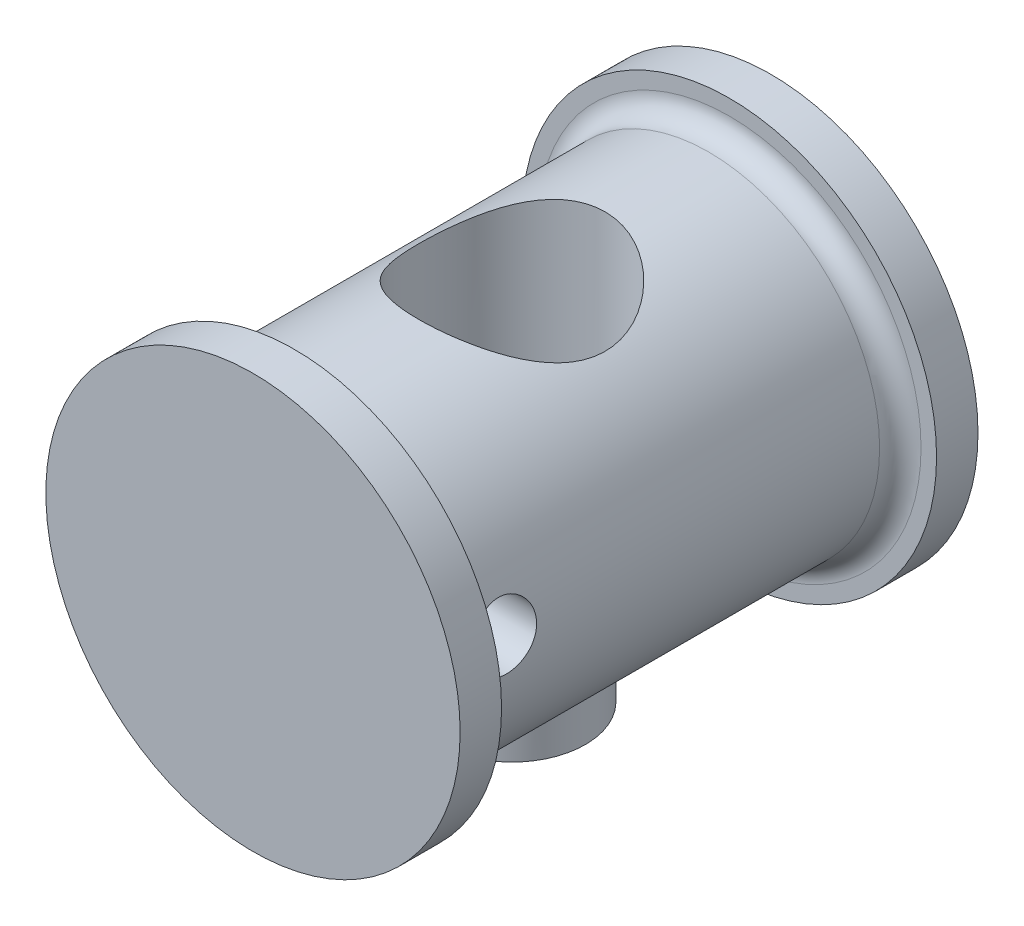
ISO-10303-21;
HEADER;
FILE_DESCRIPTION(('STEP AP214'),'2;1');
FILE_NAME('part.step','',(''),(''),'','','');
FILE_SCHEMA(('AUTOMOTIVE_DESIGN { 1 0 10303 214 1 1 1 1 }'));
ENDSEC;
DATA;
#1=APPLICATION_CONTEXT('core data for automotive mechanical design processes');
#2=APPLICATION_PROTOCOL_DEFINITION('international standard','automotive_design',2000,#1);
#3=PRODUCT_CONTEXT('',#1,'mechanical');
#4=PRODUCT('Part','Part','',(#3));
#5=PRODUCT_RELATED_PRODUCT_CATEGORY('part','',(#4));
#6=PRODUCT_DEFINITION_FORMATION('','',#4);
#7=PRODUCT_DEFINITION_CONTEXT('part definition',#1,'design');
#8=PRODUCT_DEFINITION('design','',#6,#7);
#9=PRODUCT_DEFINITION_SHAPE('','',#8);
#10=(LENGTH_UNIT() NAMED_UNIT(*) SI_UNIT(.MILLI.,.METRE.));
#11=(NAMED_UNIT(*) PLANE_ANGLE_UNIT() SI_UNIT($,.RADIAN.));
#12=(NAMED_UNIT(*) SI_UNIT($,.STERADIAN.) SOLID_ANGLE_UNIT());
#13=UNCERTAINTY_MEASURE_WITH_UNIT(LENGTH_MEASURE(1.E-05),#10,'distance_accuracy_value','');
#14=(GEOMETRIC_REPRESENTATION_CONTEXT(3) GLOBAL_UNCERTAINTY_ASSIGNED_CONTEXT((#13)) GLOBAL_UNIT_ASSIGNED_CONTEXT((#10,
#11,#12)) REPRESENTATION_CONTEXT('',''));
#15=CARTESIAN_POINT('',(0.,0.,0.));
#16=DIRECTION('',(0.,0.,1.));
#17=DIRECTION('',(1.,0.,0.));
#18=AXIS2_PLACEMENT_3D('',#15,#16,#17);
#19=CARTESIAN_POINT('',(0.,0.,23.));
#20=DIRECTION('',(0.,0.,-1.));
#21=DIRECTION('',(-1.,0.,0.));
#22=AXIS2_PLACEMENT_3D('',#19,#20,#21);
#23=CYLINDRICAL_SURFACE('',#22,8.25);
#24=CARTESIAN_POINT('',(0.,-8.25,16.05));
#25=CARTESIAN_POINT('',(0.0948469331028843,-8.24999941654784,16.0499992762641));
#26=CARTESIAN_POINT('',(0.189722373322269,-8.24835985622079,16.0461936116757));
#27=CARTESIAN_POINT('',(0.37879270250265,-8.24184301155923,16.0310085627969));
#28=CARTESIAN_POINT('',(0.47298714639651,-8.23696377467082,16.01962461106));
#29=CARTESIAN_POINT('',(0.66014822212969,-8.22408127904581,15.9893699138893));
#30=CARTESIAN_POINT('',(0.753112067923616,-8.2160718816281,15.9704844557567));
#31=CARTESIAN_POINT('',(0.936966881314438,-8.19714331725011,15.9254297808454));
#32=CARTESIAN_POINT('',(1.0278569851592,-8.18622296100178,15.8992575868364));
#33=CARTESIAN_POINT('',(1.29577426160629,-8.14958558054659,15.8103931914332));
#34=CARTESIAN_POINT('',(1.46891455704396,-8.11992880547429,15.7372107980347));
#35=CARTESIAN_POINT('',(1.80019289226469,-8.05297867683058,15.5654026633834));
#36=CARTESIAN_POINT('',(1.95833491101552,-8.01568735700486,15.4667836962963));
#37=CARTESIAN_POINT('',(2.26386131686089,-7.93495880202975,15.2413803695284));
#38=CARTESIAN_POINT('',(2.41035745076404,-7.8913117419413,15.1134658807328));
#39=CARTESIAN_POINT('',(2.68058545097449,-7.80366517504599,14.8355037504318));
#40=CARTESIAN_POINT('',(2.80430458040487,-7.75966548531235,14.6854438091956));
#41=CARTESIAN_POINT('',(3.03200593646147,-7.6736595473822,14.3577707863266));
#42=CARTESIAN_POINT('',(3.13458534663323,-7.6318844194267,14.1791156483166));
#43=CARTESIAN_POINT('',(3.30783957663943,-7.55841383436547,13.8050360181697));
#44=CARTESIAN_POINT('',(3.37853190288042,-7.52671284926156,13.6096207978374));
#45=CARTESIAN_POINT('',(3.4822714021748,-7.47926538347933,13.2178061689824));
#46=CARTESIAN_POINT('',(3.5170362384057,-7.4627953559361,13.021952693413));
#47=CARTESIAN_POINT('',(3.55328482170222,-7.44561032856402,12.6265534138518));
#48=CARTESIAN_POINT('',(3.55478872861949,-7.44488578521134,12.4270099198413));
#49=CARTESIAN_POINT('',(3.52576025142631,-7.45866543768918,12.0475497444452));
#50=CARTESIAN_POINT('',(3.49786995607576,-7.4719137589883,11.8673759144689));
#51=CARTESIAN_POINT('',(3.41529880544016,-7.51001194051937,11.5145704153489));
#52=CARTESIAN_POINT('',(3.36061240543848,-7.53486420181731,11.3419403152282));
#53=CARTESIAN_POINT('',(3.22492265821118,-7.59394040667487,11.0046196013975));
#54=CARTESIAN_POINT('',(3.14336915967483,-7.62835768394853,10.8401856823871));
#55=CARTESIAN_POINT('',(2.95665212220401,-7.70264816520028,10.5266696213183));
#56=CARTESIAN_POINT('',(2.85147894400911,-7.74252359406422,10.3775937832729));
#57=CARTESIAN_POINT('',(2.60932049805252,-7.82763336933429,10.0847923909421));
#58=CARTESIAN_POINT('',(2.47031502340579,-7.87302572643232,9.94277862191908));
#59=CARTESIAN_POINT('',(2.17004301174153,-7.96102231256706,9.68348177614448));
#60=CARTESIAN_POINT('',(2.00877056944055,-8.00362579755147,9.56620528073527));
#61=CARTESIAN_POINT('',(1.66304501378815,-8.08263506996168,9.35697022865307));
#62=CARTESIAN_POINT('',(1.47809671438876,-8.11885005791334,9.26575242598592));
#63=CARTESIAN_POINT('',(1.09352204674423,-8.17951725515854,9.11633423068023));
#64=CARTESIAN_POINT('',(0.893904422687285,-8.20397640742124,9.05811434589724));
#65=CARTESIAN_POINT('',(0.499924175597833,-8.2370522777234,8.98003019522668));
#66=CARTESIAN_POINT('',(0.306095766234473,-8.24661489219512,8.95787143282697));
#67=CARTESIAN_POINT('',(-0.0827321205770949,-8.25187318121418,8.94564290875392));
#68=CARTESIAN_POINT('',(-0.277731213842414,-8.24757318068952,8.95556313891885));
#69=CARTESIAN_POINT('',(-0.65232508916051,-8.22619674103216,9.00560882799403));
#70=CARTESIAN_POINT('',(-0.832184849764946,-8.20981859569963,9.04408413362153));
#71=CARTESIAN_POINT('',(-1.18267511571,-8.16669932868962,9.14780751506341));
#72=CARTESIAN_POINT('',(-1.35330447239368,-8.13995692061989,9.21305891433391));
#73=CARTESIAN_POINT('',(-1.68652419849457,-8.07760979610183,9.37059675749733));
#74=CARTESIAN_POINT('',(-1.84869694075649,-8.04175433329538,9.46366405264152));
#75=CARTESIAN_POINT('',(-2.15570820818722,-7.96495486748056,9.67333846910314));
#76=CARTESIAN_POINT('',(-2.30053927125945,-7.92400868928249,9.78995566633415));
#77=CARTESIAN_POINT('',(-2.58033519598601,-7.83756420069752,10.0537606637086));
#78=CARTESIAN_POINT('',(-2.71371529758467,-7.79195634876633,10.2025975974126));
#79=CARTESIAN_POINT('',(-2.95409184521255,-7.70404191670882,10.5211935446004));
#80=CARTESIAN_POINT('',(-3.06108074727041,-7.66173628288428,10.690958519652));
#81=CARTESIAN_POINT('',(-3.24724631413392,-7.58473920147911,11.0509711298865));
#82=CARTESIAN_POINT('',(-3.32587129526257,-7.55020325156891,11.241539833683));
#83=CARTESIAN_POINT('',(-3.44920536829271,-7.49467415061237,11.6351758349875));
#84=CARTESIAN_POINT('',(-3.49394494958785,-7.47366882753414,11.8382317184579));
#85=CARTESIAN_POINT('',(-3.54511560261101,-7.44952230206882,12.2333795118794));
#86=CARTESIAN_POINT('',(-3.5543533697529,-7.44507320565556,12.4250291991556));
#87=CARTESIAN_POINT('',(-3.54185229338584,-7.4510291431009,12.8070595627466));
#88=CARTESIAN_POINT('',(-3.52011902597578,-7.46143150306852,12.9974404612974));
#89=CARTESIAN_POINT('',(-3.44870101169222,-7.49468959537969,13.3611043443057));
#90=CARTESIAN_POINT('',(-3.40055637869725,-7.51685713763611,13.5347589778937));
#91=CARTESIAN_POINT('',(-3.2792442769436,-7.57056355625933,13.8715375982604));
#92=CARTESIAN_POINT('',(-3.20606968134227,-7.6021051013731,14.0346585700206));
#93=CARTESIAN_POINT('',(-3.03155003601852,-7.67343512816292,14.3568342582736));
#94=CARTESIAN_POINT('',(-2.92873555963809,-7.71361461383294,14.5150045492172));
#95=CARTESIAN_POINT('',(-2.69983031900395,-7.79668022972563,14.8127253594895));
#96=CARTESIAN_POINT('',(-2.57373065064436,-7.83956739120328,14.9522687207138));
#97=CARTESIAN_POINT('',(-2.28994484021477,-7.92732162881532,15.2202438533367));
#98=CARTESIAN_POINT('',(-2.13054091303928,-7.97207351335353,15.3468997420883));
#99=CARTESIAN_POINT('',(-1.79100725750145,-8.05513647020764,15.571838288264));
#100=CARTESIAN_POINT('',(-1.610868183702,-8.09344461900267,15.6701080813503));
#101=CARTESIAN_POINT('',(-1.33026352287112,-8.14259353909228,15.7928985739159));
#102=CARTESIAN_POINT('',(-1.23565746811196,-8.1575187824491,15.8295626171587));
#103=CARTESIAN_POINT('',(-1.04328148603078,-8.18434271709117,15.8947542449475));
#104=CARTESIAN_POINT('',(-0.9455130956649,-8.19624285444334,15.9232857178343));
#105=CARTESIAN_POINT('',(-0.747802355913359,-8.21663875919326,15.9718344998425));
#106=CARTESIAN_POINT('',(-0.647865925522157,-8.22514280335794,15.9918725161535));
#107=CARTESIAN_POINT('',(-0.446449899101305,-8.2385285033673,16.0232877024214));
#108=CARTESIAN_POINT('',(-0.344971459352585,-8.2434127487849,16.0346710639951));
#109=CARTESIAN_POINT('',(-0.2027157238319,-8.24760872449806,16.0444398160064));
#110=CARTESIAN_POINT('',(-0.162207843747729,-8.24850486040589,16.0465241995115));
#111=CARTESIAN_POINT('',(-0.0811350479585505,-8.24970062495101,16.0493044509743));
#112=CARTESIAN_POINT('',(-0.0405701318709548,-8.2500002495677,16.0500003095731));
#113=CARTESIAN_POINT('',(0.,-8.25,16.05));
#114=B_SPLINE_CURVE_WITH_KNOTS('',3,(#24,#25,#26,#27,#28,#29,#30,#31,#32,#33,#34,#35,#36,#37,
#38,#39,#40,#41,#42,#43,#44,#45,#46,#47,#48,#49,#50,#51,#52,#53,#54,#55,#56,#57,#58,#59,#60,#61,
#62,#63,#64,#65,#66,#67,#68,#69,#70,#71,#72,#73,#74,#75,#76,#77,#78,#79,#80,#81,#82,#83,#84,#85,
#86,#87,#88,#89,#90,#91,#92,#93,#94,#95,#96,#97,#98,#99,#100,#101,#102,#103,#104,#105,#106,#107,
#108,#109,#110,#111,#112,#113),.UNSPECIFIED.,.T.,.F.,(4,2,2,2,2,2,2,2,2,2,2,2,2,2,2,2,2,2,2,2,2,
2,2,2,2,2,2,2,2,2,2,2,2,2,2,2,2,2,2,2,2,2,2,2,4),(0.,0.284499582123413,0.569170788053065,
0.854403098267682,1.13975212077609,1.70784337353672,2.27578349045981,2.87114926051802,
3.46684695389576,4.09428388279809,4.72137592048183,5.31686421920878,5.91199157537535,
6.45784623558598,7.00381389312939,7.5617391167497,8.11989244638598,8.72867275791427,
9.33761483149395,9.96245156924814,10.5869188250354,11.1698322680953,11.7525638685031,
12.3040116219281,12.8555278419134,13.4242724136882,13.9932608424886,14.605463553054,
15.2178410605852,15.8415579662998,16.4647129953207,17.037447781605,17.6100794643797,
18.1524063996287,18.6948878816733,19.2711209650207,19.8475748541756,20.4700394343669,
21.0927856692264,21.4001056661737,21.7072784800085,22.013698032749,22.3198981634097,
22.4415901084303,22.5632828736719),.UNSPECIFIED.);
#115=CARTESIAN_POINT('',(0.,-8.25,16.05));
#116=VERTEX_POINT('',#115);
#117=EDGE_CURVE('E144',#116,#116,#114,.T.);
#118=ORIENTED_EDGE('',*,*,#117,.T.);
#119=EDGE_LOOP('',(#118));
#120=FACE_BOUND('',#119,.T.);
#121=CARTESIAN_POINT('',(0.,8.25,17.));
#122=CARTESIAN_POINT('',(-0.117007792381533,8.25000089369985,17.0000010184365));
#123=CARTESIAN_POINT('',(-0.234003420881799,8.24750583855399,16.9954320889132));
#124=CARTESIAN_POINT('',(-0.467116010873188,8.23759141748326,16.9772169926997));
#125=CARTESIAN_POINT('',(-0.583232690180944,8.23017053275026,16.9635680263089));
#126=CARTESIAN_POINT('',(-0.813773759209355,8.21058288767439,16.9273471687061));
#127=CARTESIAN_POINT('',(-0.928196339379707,8.19841138606453,16.9047663629303));
#128=CARTESIAN_POINT('',(-1.15445890990384,8.16962292222351,16.8509487487343));
#129=CARTESIAN_POINT('',(-1.26629782511657,8.15300414429728,16.8197084046865));
#130=CARTESIAN_POINT('',(-1.48611767232912,8.1158067902385,16.7490843476864));
#131=CARTESIAN_POINT('',(-1.59411388426755,8.09524663528627,16.7097384569149));
#132=CARTESIAN_POINT('',(-1.80617898604951,8.05058900158713,16.6232087052642));
#133=CARTESIAN_POINT('',(-1.91024638018985,8.02649019240801,16.5760218955428));
#134=CARTESIAN_POINT('',(-2.21563066426775,7.94968018368127,16.4233532711087));
#135=CARTESIAN_POINT('',(-2.41034577816859,7.89241725192212,16.3066929924822));
#136=CARTESIAN_POINT('',(-2.79102264454454,7.76631680324919,16.0381018671834));
#137=CARTESIAN_POINT('',(-2.97548660882861,7.69695676253121,15.8843108499678));
#138=CARTESIAN_POINT('',(-3.31742706348696,7.55588682742557,15.5499130861412));
#139=CARTESIAN_POINT('',(-3.47487876280306,7.4841748456225,15.3692819871682));
#140=CARTESIAN_POINT('',(-3.77370766706972,7.33838324825958,14.9653693760866));
#141=CARTESIAN_POINT('',(-3.91206770934792,7.26474289282666,14.7396542239182));
#142=CARTESIAN_POINT('',(-4.08918174832862,7.16559101578268,14.3831494708436));
#143=CARTESIAN_POINT('',(-4.14316145664846,7.13441680430406,14.2612829975954));
#144=CARTESIAN_POINT('',(-4.24039560985482,7.07705641005852,14.0122427700648));
#145=CARTESIAN_POINT('',(-4.28365694104436,7.05086702717761,13.8850724850448));
#146=CARTESIAN_POINT('',(-4.35649685900765,7.00607962860003,13.6344140144808));
#147=CARTESIAN_POINT('',(-4.38676086645427,6.98710985197453,13.5111913345982));
#148=CARTESIAN_POINT('',(-4.43684997851687,6.95541114205248,13.2619109383586));
#149=CARTESIAN_POINT('',(-4.45668117946307,6.94267856439683,13.1358549226475));
#150=CARTESIAN_POINT('',(-4.4855622164643,6.92405439774008,12.8821249703092));
#151=CARTESIAN_POINT('',(-4.49462196143917,6.91815652146044,12.7544526300424));
#152=CARTESIAN_POINT('',(-4.50181757609972,6.91347663111143,12.4986790518571));
#153=CARTESIAN_POINT('',(-4.49995489136689,6.91469367538362,12.3705778729381));
#154=CARTESIAN_POINT('',(-4.48643899826711,6.92346836270181,12.1343575226411));
#155=CARTESIAN_POINT('',(-4.47629021539421,6.93005146116994,12.0261125609943));
#156=CARTESIAN_POINT('',(-4.44826868009311,6.94806975608009,11.8110252239356));
#157=CARTESIAN_POINT('',(-4.43039357007402,6.95950643351092,11.7041832869004));
#158=CARTESIAN_POINT('',(-4.36548093483983,7.00055530889966,11.3868537695812));
#159=CARTESIAN_POINT('',(-4.30714809809194,7.03691206132032,11.1794284652603));
#160=CARTESIAN_POINT('',(-4.16127143810793,7.12415675670677,10.7732944527693));
#161=CARTESIAN_POINT('',(-4.07311742117085,7.17534474334264,10.5748750870656));
#162=CARTESIAN_POINT('',(-3.87059595680085,7.28658520272543,10.1945909307381));
#163=CARTESIAN_POINT('',(-3.75621709609637,7.34664153098619,10.0127333962509));
#164=CARTESIAN_POINT('',(-3.48397421759499,7.48002699593312,9.64117127017421));
#165=CARTESIAN_POINT('',(-3.32211977995778,7.55397177425163,9.45460851015597));
#166=CARTESIAN_POINT('',(-2.96934435934312,7.69946976800308,9.10975019326253));
#167=CARTESIAN_POINT('',(-2.7784042459011,7.77102137132335,8.95147339085614));
#168=CARTESIAN_POINT('',(-2.46629838244328,7.87356227290601,8.73371407729011));
#169=CARTESIAN_POINT('',(-2.35417546263094,7.90789305310131,8.66260652239333));
#170=CARTESIAN_POINT('',(-2.12330955137979,7.97297996992391,8.53020909612023));
#171=CARTESIAN_POINT('',(-2.00456941571981,8.00373763118588,8.46891503311493));
#172=CARTESIAN_POINT('',(-1.76127069630589,8.06077133332144,8.35682975549779));
#173=CARTESIAN_POINT('',(-1.6367150243097,8.08704958695909,8.30603335254115));
#174=CARTESIAN_POINT('',(-1.38266029694342,8.13433668772996,8.2155603896814));
#175=CARTESIAN_POINT('',(-1.25316193502407,8.15534627094015,8.17588227636997));
#176=CARTESIAN_POINT('',(-1.00246543862861,8.18975372104531,8.1113511619828));
#177=CARTESIAN_POINT('',(-0.881603607202891,8.20367496629183,8.08546822683856));
#178=CARTESIAN_POINT('',(-0.637683356689429,8.2262296932861,8.04369375624567));
#179=CARTESIAN_POINT('',(-0.514625185333369,8.23486376755874,8.0278011011968));
#180=CARTESIAN_POINT('',(-0.267414022604209,8.24659292438812,8.00624023936193));
#181=CARTESIAN_POINT('',(-0.143261602806632,8.24969074429948,8.00056697967042));
#182=CARTESIAN_POINT('',(0.105094522463022,8.25026511243061,7.99951394991383));
#183=CARTESIAN_POINT('',(0.229298224240659,8.2477420123141,8.0041335358936));
#184=CARTESIAN_POINT('',(0.464766357440056,8.23765808168688,8.02266096465183));
#185=CARTESIAN_POINT('',(0.576127090694423,8.2306047364012,8.03563343628039));
#186=CARTESIAN_POINT('',(0.79722983027333,8.21214110440063,8.06976759693619));
#187=CARTESIAN_POINT('',(0.906971322100649,8.20072946257988,8.09093183302011));
#188=CARTESIAN_POINT('',(1.23258263487128,8.16032407696679,8.16638040348866));
#189=CARTESIAN_POINT('',(1.44505032291272,8.12515013767801,8.23263770050433));
#190=CARTESIAN_POINT('',(1.86025013040791,8.04040023219325,8.39627993230885));
#191=CARTESIAN_POINT('',(2.06264237391396,7.99050929775287,8.49435086782171));
#192=CARTESIAN_POINT('',(2.44867183357358,7.88078693610931,8.71796371591718));
#193=CARTESIAN_POINT('',(2.63230202421935,7.82095180714058,8.843515864028));
#194=CARTESIAN_POINT('',(2.99723208486553,7.68900498937391,9.13445128873896));
#195=CARTESIAN_POINT('',(3.1760187046102,7.61626764783951,9.30270668812027));
#196=CARTESIAN_POINT('',(3.50415737193942,7.47098683035649,9.6661037248331));
#197=CARTESIAN_POINT('',(3.65347965012748,7.39844362279006,9.86127221919359));
#198=CARTESIAN_POINT('',(3.92944898687598,7.25588417984368,10.2910990645331));
#199=CARTESIAN_POINT('',(4.0535640378445,7.18646297403647,10.5276193811653));
#200=CARTESIAN_POINT('',(4.20761078408267,7.09662217794278,10.8987501908887));
#201=CARTESIAN_POINT('',(4.25360320297495,7.06905857631062,11.0251756626482));
#202=CARTESIAN_POINT('',(4.33433174884695,7.01985100765393,11.2827297484813));
#203=CARTESIAN_POINT('',(4.36906995641875,6.99820594657067,11.4138574882513));
#204=CARTESIAN_POINT('',(4.42387722995371,6.96367396559795,11.6667017857321));
#205=CARTESIAN_POINT('',(4.44504451464114,6.9501399205357,11.7880930588359));
#206=CARTESIAN_POINT('',(4.47737331610679,6.92935791178956,12.0327292377765));
#207=CARTESIAN_POINT('',(4.48853637874118,6.9221089769337,12.1559738542406));
#208=CARTESIAN_POINT('',(4.50065605621569,6.91423517050554,12.4030960240519));
#209=CARTESIAN_POINT('',(4.50161925951584,6.91360602297358,12.5269731171092));
#210=CARTESIAN_POINT('',(4.49333905506219,6.91899044093653,12.7742326584571));
#211=CARTESIAN_POINT('',(4.48409643948298,6.92500349086479,12.8976151443931));
#212=CARTESIAN_POINT('',(4.45746377525031,6.94217025370118,13.1264782525035));
#213=CARTESIAN_POINT('',(4.44131513701503,6.95253751008297,13.2321652823889));
#214=CARTESIAN_POINT('',(4.40167195870551,6.97770223030044,13.4416265902989));
#215=CARTESIAN_POINT('',(4.37817522144806,6.99250101916934,13.5454002863691));
#216=CARTESIAN_POINT('',(4.29703572943127,7.04287491937716,13.8529052173424));
#217=CARTESIAN_POINT('',(4.22872862247246,7.08443791479039,14.0529466422591));
#218=CARTESIAN_POINT('',(4.06112043797197,7.1819010842815,14.451134524227));
#219=CARTESIAN_POINT('',(3.96015468752436,7.23853268548941,14.6483878553873));
#220=CARTESIAN_POINT('',(3.73166160734071,7.35893154902422,15.0245086872512));
#221=CARTESIAN_POINT('',(3.60412009280077,7.42270261359179,15.2033662927863));
#222=CARTESIAN_POINT('',(3.30333049063788,7.56187884473646,15.5662320000799));
#223=CARTESIAN_POINT('',(3.12607163629102,7.63756728917462,15.7468166219124));
#224=CARTESIAN_POINT('',(2.74224520268529,7.78361480965464,16.0768815939618));
#225=CARTESIAN_POINT('',(2.53565734214139,7.85397014572315,16.226340242351));
#226=CARTESIAN_POINT('',(2.2035859476611,7.95114287013068,16.4257676148564));
#227=CARTESIAN_POINT('',(2.0871757672623,7.98256521993545,16.4889031702843));
#228=CARTESIAN_POINT('',(1.84839949407603,8.04120610256207,16.6049986938291));
#229=CARTESIAN_POINT('',(1.72603636362426,8.06842669870084,16.6579636594632));
#230=CARTESIAN_POINT('',(1.47644082407469,8.1178063375963,16.752989908152));
#231=CARTESIAN_POINT('',(1.3492184128093,8.13997518158238,16.7950723269093));
#232=CARTESIAN_POINT('',(1.09077865439623,8.17861588272002,16.8678610286156));
#233=CARTESIAN_POINT('',(0.959563473302341,8.19509077090613,16.8985733647646));
#234=CARTESIAN_POINT('',(0.691117115336179,8.22213382961657,16.9487575264993));
#235=CARTESIAN_POINT('',(0.553817097099698,8.23255169912353,16.9679436925483));
#236=CARTESIAN_POINT('',(0.27767233901349,8.24648423502174,16.9935642898123));
#237=CARTESIAN_POINT('',(0.13882760772238,8.24999893964146,16.9999987916437));
#238=CARTESIAN_POINT('',(0.,8.25,17.));
#239=B_SPLINE_CURVE_WITH_KNOTS('',3,(#121,#122,#123,#124,#125,#126,#127,#128,#129,#130,#131,
#132,#133,#134,#135,#136,#137,#138,#139,#140,#141,#142,#143,#144,#145,#146,#147,#148,#149,#150,
#151,#152,#153,#154,#155,#156,#157,#158,#159,#160,#161,#162,#163,#164,#165,#166,#167,#168,#169,
#170,#171,#172,#173,#174,#175,#176,#177,#178,#179,#180,#181,#182,#183,#184,#185,#186,#187,#188,
#189,#190,#191,#192,#193,#194,#195,#196,#197,#198,#199,#200,#201,#202,#203,#204,#205,#206,#207,
#208,#209,#210,#211,#212,#213,#214,#215,#216,#217,#218,#219,#220,#221,#222,#223,#224,#225,#226,
#227,#228,#229,#230,#231,#232,#233,#234,#235,#236,#237,#238),.UNSPECIFIED.,.T.,.F.,(4,2,2,2,2,2,
2,2,2,2,2,2,2,2,2,2,2,2,2,2,2,2,2,2,2,2,2,2,2,2,2,2,2,2,2,2,2,2,2,2,2,2,2,2,2,2,2,2,2,2,2,2,2,2,
2,2,2,2,4),(0.,0.350887451413885,0.701883144173696,1.05323004126906,1.40472060262912,
1.75460674814904,2.10462477921992,2.80397738203513,3.55092955243566,4.2985636281432,
5.11834027886657,5.52849755401585,5.93839062549629,6.32270307061527,6.70679069557003,
7.09052471507522,7.47420794860252,7.80056351286968,8.12701873078315,8.77953109879984,
9.44629555271629,10.1133507407718,10.8836481277843,11.6544543662226,12.0653969273534,
12.4761634919287,12.8867265518679,13.2972322207461,13.6698697979968,14.0424656066962,
14.4148771374941,14.7872653696248,15.1238631834889,15.4605657395382,16.1333428862128,
16.8217165166313,17.5103469731834,18.2752887115822,19.0409993980104,19.863992677916,
20.2754290797198,20.6867893748618,21.0581353419347,21.4294239185902,21.8004726518137,
22.1714925862985,22.4933660395422,22.815335829571,23.458896877834,24.142519388044,
24.826507720489,25.6154854230863,26.4050113930195,26.8128495556257,27.2204868033274,
27.6273263032736,28.033948897638,28.4502727529404,28.8665943027116),.UNSPECIFIED.);
#240=CARTESIAN_POINT('',(0.,8.25,17.));
#241=VERTEX_POINT('',#240);
#242=EDGE_CURVE('E77',#241,#241,#239,.T.);
#243=ORIENTED_EDGE('',*,*,#242,.T.);
#244=EDGE_LOOP('',(#243));
#245=FACE_BOUND('',#244,.T.);
#246=CARTESIAN_POINT('',(0.,0.,3.));
#247=DIRECTION('',(0.,0.,1.));
#248=DIRECTION('',(1.,0.,0.));
#249=AXIS2_PLACEMENT_3D('',#246,#247,#248);
#250=CIRCLE('',#249,8.25);
#251=CARTESIAN_POINT('',(8.25,0.,3.));
#252=VERTEX_POINT('',#251);
#253=EDGE_CURVE('E80',#252,#252,#250,.T.);
#254=ORIENTED_EDGE('',*,*,#253,.T.);
#255=EDGE_LOOP('',(#254));
#256=FACE_BOUND('',#255,.T.);
#257=CARTESIAN_POINT('',(8.24971947258661,-0.0680339887498946,22.));
#258=CARTESIAN_POINT('',(8.24948723252854,-0.0961645053446424,21.9685487148792));
#259=CARTESIAN_POINT('',(8.24912273814914,-0.122953248243338,21.9359259840865));
#260=CARTESIAN_POINT('',(8.24821051810472,-0.173686995998515,21.8685450019542));
#261=CARTESIAN_POINT('',(8.24766280345089,-0.197632171630893,21.8337868790501));
#262=CARTESIAN_POINT('',(8.2458685068567,-0.264897601747408,21.7267248930772));
#263=CARTESIAN_POINT('',(8.24446955253979,-0.303735613923994,21.6515349883216));
#264=CARTESIAN_POINT('',(8.2418414665835,-0.368238334901978,21.4957053688148));
#265=CARTESIAN_POINT('',(8.24061241014756,-0.393897223668673,21.4150632640753));
#266=CARTESIAN_POINT('',(8.23873903150836,-0.43131551315592,21.2506171747957));
#267=CARTESIAN_POINT('',(8.23809457673148,-0.443078065415274,21.1668139116227));
#268=CARTESIAN_POINT('',(8.23758993055816,-0.452365967012151,20.9984587376888));
#269=CARTESIAN_POINT('',(8.23772939945298,-0.449897483273904,20.9139071670596));
#270=CARTESIAN_POINT('',(8.23874945207062,-0.430809423941379,20.7464071939696));
#271=CARTESIAN_POINT('',(8.23963015630445,-0.414187547264778,20.6634590544402));
#272=CARTESIAN_POINT('',(8.24185367782964,-0.367279426807009,20.5015870067959));
#273=CARTESIAN_POINT('',(8.24319619532175,-0.337002043929898,20.422660525977));
#274=CARTESIAN_POINT('',(8.24586758612433,-0.263643960016149,20.2710044628627));
#275=CARTESIAN_POINT('',(8.2471964600133,-0.220563804173631,20.1982746168592));
#276=CARTESIAN_POINT('',(8.24923165463562,-0.122742823235063,20.0609632689605));
#277=CARTESIAN_POINT('',(8.24993708881458,-0.0679855296305441,19.9963934823571));
#278=CARTESIAN_POINT('',(8.25005477350586,0.051598073873138,19.8773647305621));
#279=CARTESIAN_POINT('',(8.24946704033135,0.116424256744707,19.8229056378346));
#280=CARTESIAN_POINT('',(8.24637443821306,0.253999896688157,19.7258564086853));
#281=CARTESIAN_POINT('',(8.24387717466023,0.326716942065153,19.6832200995114));
#282=CARTESIAN_POINT('',(8.2364803447769,0.478153256056453,19.6107424291222));
#283=CARTESIAN_POINT('',(8.23158096909051,0.556872047922277,19.580900052866));
#284=CARTESIAN_POINT('',(8.21914320059451,0.717362912715248,19.5349861302424));
#285=CARTESIAN_POINT('',(8.21162548827814,0.799106698759527,19.5188099766796));
#286=CARTESIAN_POINT('',(8.19392140122831,0.963854235680915,19.5001826988775));
#287=CARTESIAN_POINT('',(8.18373498887483,1.04685800430415,19.4977317681302));
#288=CARTESIAN_POINT('',(8.16089001710017,1.21217576475431,19.5064864625457));
#289=CARTESIAN_POINT('',(8.14822042670795,1.29448490360599,19.5177542389069));
#290=CARTESIAN_POINT('',(8.12094681150933,1.45582369303329,19.5535773384283));
#291=CARTESIAN_POINT('',(8.10634253156168,1.5348529092538,19.5781344154631));
#292=CARTESIAN_POINT('',(8.07557195158347,1.68937521642616,19.640478393125));
#293=CARTESIAN_POINT('',(8.05937744325289,1.76474510959109,19.6785566909859));
#294=CARTESIAN_POINT('',(8.02666833434075,1.90801015649593,19.7667533329439));
#295=CARTESIAN_POINT('',(8.01015367818191,1.97590399848624,19.8168737850667));
#296=CARTESIAN_POINT('',(7.97755050935462,2.10371813365997,19.9289968934552));
#297=CARTESIAN_POINT('',(7.96147714113128,2.16345164379537,19.9912172883965));
#298=CARTESIAN_POINT('',(7.93130494964506,2.27157681334963,20.1252641678683));
#299=CARTESIAN_POINT('',(7.91720599015316,2.31996925542773,20.1970899889804));
#300=CARTESIAN_POINT('',(7.89231491640331,2.40327632798399,20.3473743388714));
#301=CARTESIAN_POINT('',(7.88147952749975,2.43836908981263,20.4257266961878));
#302=CARTESIAN_POINT('',(7.86381299466963,2.49476008096934,20.5876735343188));
#303=CARTESIAN_POINT('',(7.85698068272496,2.51606233428356,20.6712664781462));
#304=CARTESIAN_POINT('',(7.84816124917652,2.54343539037272,20.837422079966));
#305=CARTESIAN_POINT('',(7.84597696925403,2.55012631503799,20.9198723714006));
#306=CARTESIAN_POINT('',(7.84606037814187,2.54987014650695,21.0847355060923));
#307=CARTESIAN_POINT('',(7.8483269270628,2.54292654521119,21.1671483535323));
#308=CARTESIAN_POINT('',(7.85699063025098,2.51602600107741,21.3274261120182));
#309=CARTESIAN_POINT('',(7.86328194773693,2.49640236779537,21.4053533236194));
#310=CARTESIAN_POINT('',(7.87937579055541,2.44512850158337,21.5567809277983));
#311=CARTESIAN_POINT('',(7.88917890659225,2.41347624531669,21.6302805732034));
#312=CARTESIAN_POINT('',(7.90895293500081,2.34773296224951,21.7547459851613));
#313=CARTESIAN_POINT('',(7.91836528278928,2.31588229606014,21.8070030654176));
#314=CARTESIAN_POINT('',(7.93839415694291,2.24626413905318,21.9070082873721));
#315=CARTESIAN_POINT('',(7.94900826144995,2.20850849174703,21.9547651542717));
#316=CARTESIAN_POINT('',(7.96003320493233,2.16803398874989,22.));
#317=B_SPLINE_CURVE_WITH_KNOTS('',3,(#257,#258,#259,#260,#261,#262,#263,#264,#265,#266,#267,
#268,#269,#270,#271,#272,#273,#274,#275,#276,#277,#278,#279,#280,#281,#282,#283,#284,#285,#286,
#287,#288,#289,#290,#291,#292,#293,#294,#295,#296,#297,#298,#299,#300,#301,#302,#303,#304,#305,
#306,#307,#308,#309,#310,#311,#312,#313,#314,#315,#316),.UNSPECIFIED.,.F.,.F.,(4,2,2,2,2,2,2,2,
2,2,2,2,2,2,2,2,2,2,2,2,2,2,2,2,2,2,2,2,2,4),(0.,0.126511623356167,0.253015644967096,
0.505632920479003,0.758361658634982,1.01103306963747,1.2635949954072,1.51619799095968,
1.76863731057623,2.02106588184028,2.27385284096475,2.52663661122591,2.77841878995563,
3.03018098917459,3.27999816657284,3.52981886577329,3.78077557576207,4.03176541420319,
4.28853013439645,4.54533983503742,4.8072894420442,5.06922096630141,5.32750862679913,
5.58572088652416,5.83274214915446,6.07970015610697,6.32041700905937,6.56117437096991,
6.74648621022319,6.93143102987779),.UNSPECIFIED.);
#318=CARTESIAN_POINT('',(8.24971947258662,-0.0680339887498946,22.));
#319=VERTEX_POINT('',#318);
#320=CARTESIAN_POINT('',(7.96003320493233,2.1680339887499,22.));
#321=VERTEX_POINT('',#320);
#322=EDGE_CURVE('E53',#319,#321,#317,.T.);
#323=ORIENTED_EDGE('',*,*,#322,.F.);
#324=CARTESIAN_POINT('',(0.,0.,22.));
#325=DIRECTION('',(0.,0.,1.));
#326=DIRECTION('',(1.,0.,0.));
#327=AXIS2_PLACEMENT_3D('',#324,#325,#326);
#328=CIRCLE('',#327,8.25);
#329=CARTESIAN_POINT('',(-8.24971947258661,-0.0680339887498944,22.));
#330=VERTEX_POINT('',#329);
#331=EDGE_CURVE('E76',#319,#330,#328,.F.);
#332=ORIENTED_EDGE('',*,*,#331,.T.);
#333=CARTESIAN_POINT('',(-7.96003320493233,2.1680339887499,22.));
#334=CARTESIAN_POINT('',(-7.95254579498276,2.19552428588211,21.9692630035139));
#335=CARTESIAN_POINT('',(-7.94524740964409,2.22175913044929,21.9373810675962));
#336=CARTESIAN_POINT('',(-7.93115165471205,2.27156399961497,21.8714871962848));
#337=CARTESIAN_POINT('',(-7.92435437310337,2.2951335566236,21.8374748887665));
#338=CARTESIAN_POINT('',(-7.90490102174719,2.36160479248232,21.7324907737364));
#339=CARTESIAN_POINT('',(-7.89318528928753,2.40026240843228,21.6585791784848));
#340=CARTESIAN_POINT('',(-7.87322567404084,2.46494934147674,21.5048657140931));
#341=CARTESIAN_POINT('',(-7.86498743891246,2.49095812647074,21.4250545087335));
#342=CARTESIAN_POINT('',(-7.85273580765281,2.52931835327767,21.2619573555376));
#343=CARTESIAN_POINT('',(-7.84871831403496,2.54168304133818,21.1786748594569));
#344=CARTESIAN_POINT('',(-7.84532227266715,2.55214559065342,21.0136696599654));
#345=CARTESIAN_POINT('',(-7.84580680548357,2.55066453184747,20.9319761935912));
#346=CARTESIAN_POINT('',(-7.85104375515075,2.53449844383447,20.7700271475811));
#347=CARTESIAN_POINT('',(-7.85579724941756,2.51981008131883,20.6897719361528));
#348=CARTESIAN_POINT('',(-7.86908226854792,2.47800587807887,20.5339140260197));
#349=CARTESIAN_POINT('',(-7.87756948531167,2.45103565805074,20.4582682698955));
#350=CARTESIAN_POINT('',(-7.89763061845286,2.38560177855094,20.3125793632747));
#351=CARTESIAN_POINT('',(-7.9092046976924,2.34713751264331,20.2425365086393));
#352=CARTESIAN_POINT('',(-7.93500811257199,2.25839418503469,20.1075187178441));
#353=CARTESIAN_POINT('',(-7.94931232007881,2.20776784557461,20.0427865451047));
#354=CARTESIAN_POINT('',(-7.97928958917648,2.09683913010993,19.9225861955274));
#355=CARTESIAN_POINT('',(-7.99496300387845,2.03653425468645,19.8671204192478));
#356=CARTESIAN_POINT('',(-8.02730835400312,1.90514395650598,19.7647089290012));
#357=CARTESIAN_POINT('',(-8.04399496588082,1.83371964965641,19.7182018828052));
#358=CARTESIAN_POINT('',(-8.07668357339361,1.68391072223951,19.637876006237));
#359=CARTESIAN_POINT('',(-8.09268552380692,1.60552564296271,19.6040580128319));
#360=CARTESIAN_POINT('',(-8.1232204996244,1.44314492815295,19.5498877561446));
#361=CARTESIAN_POINT('',(-8.13773915409029,1.35910549549936,19.5296582571289));
#362=CARTESIAN_POINT('',(-8.16440905283044,1.18843524834331,19.5039116857931));
#363=CARTESIAN_POINT('',(-8.17656062953075,1.10180479969024,19.4983925462068));
#364=CARTESIAN_POINT('',(-8.19780612557409,0.930464128031401,19.5023715207164));
#365=CARTESIAN_POINT('',(-8.20696188154896,0.845753929263501,19.5115392919783));
#366=CARTESIAN_POINT('',(-8.22244891850027,0.678864306185622,19.5441550469776));
#367=CARTESIAN_POINT('',(-8.22878054974591,0.596684569206402,19.5676012589417));
#368=CARTESIAN_POINT('',(-8.2386808754553,0.439035778340398,19.6275258468797));
#369=CARTESIAN_POINT('',(-8.24230480457407,0.36346203454414,19.6637201782602));
#370=CARTESIAN_POINT('',(-8.24739948880895,0.219334945620861,19.748212010301));
#371=CARTESIAN_POINT('',(-8.2488702451954,0.150781596351912,19.7965095038206));
#372=CARTESIAN_POINT('',(-8.25021726702056,0.0227443335129853,19.9037736294867));
#373=CARTESIAN_POINT('',(-8.25009560846738,-0.0367512860792968,19.9627262717499));
#374=CARTESIAN_POINT('',(-8.24890206039383,-0.145116600163401,20.0896908802656));
#375=CARTESIAN_POINT('',(-8.24783014458605,-0.193986000650529,20.1577030970932));
#376=CARTESIAN_POINT('',(-8.24535802725559,-0.280085896668591,20.301467807248));
#377=CARTESIAN_POINT('',(-8.24395528421446,-0.31722079837993,20.3772775242827));
#378=CARTESIAN_POINT('',(-8.2413802071242,-0.378274529420342,20.5340508667068));
#379=CARTESIAN_POINT('',(-8.24020788220134,-0.402192835342062,20.6150146960693));
#380=CARTESIAN_POINT('',(-8.23847938406981,-0.436178205265763,20.7800260701139));
#381=CARTESIAN_POINT('',(-8.2379248172367,-0.446209173944636,20.864081069973));
#382=CARTESIAN_POINT('',(-8.23760841064573,-0.452013993509091,21.0326821236595));
#383=CARTESIAN_POINT('',(-8.23784654652956,-0.447788282476047,21.1172281623185));
#384=CARTESIAN_POINT('',(-8.23904198929558,-0.425220413865967,21.2842930677783));
#385=CARTESIAN_POINT('',(-8.23999837574931,-0.406896322438847,21.3668143895794));
#386=CARTESIAN_POINT('',(-8.2423244969976,-0.356669471297323,21.5276077407226));
#387=CARTESIAN_POINT('',(-8.24369412938449,-0.324770074915921,21.6058808171712));
#388=CARTESIAN_POINT('',(-8.24604201280126,-0.257195052265782,21.7385305799702));
#389=CARTESIAN_POINT('',(-8.24703742335966,-0.224106510186453,21.7942422343541));
#390=CARTESIAN_POINT('',(-8.24869660246059,-0.151072086925733,21.9008951907409));
#391=CARTESIAN_POINT('',(-8.24936070255675,-0.111133115221932,21.9518412202029));
#392=CARTESIAN_POINT('',(-8.24971947258662,-0.0680339887498944,22.));
#393=B_SPLINE_CURVE_WITH_KNOTS('',3,(#333,#334,#335,#336,#337,#338,#339,#340,#341,#342,#343,
#344,#345,#346,#347,#348,#349,#350,#351,#352,#353,#354,#355,#356,#357,#358,#359,#360,#361,#362,
#363,#364,#365,#366,#367,#368,#369,#370,#371,#372,#373,#374,#375,#376,#377,#378,#379,#380,#381,
#382,#383,#384,#385,#386,#387,#388,#389,#390,#391,#392),.UNSPECIFIED.,.F.,.F.,(4,2,2,2,2,2,2,2,
2,2,2,2,2,2,2,2,2,2,2,2,2,2,2,2,2,2,2,2,2,4),(0.,0.125661922597509,0.251345856847046,
0.502743675774804,0.754548223065127,1.00610809252971,1.25004296257262,1.49403941509423,
1.7352153414519,1.97640399471052,2.22553308309376,2.47472661126949,2.73406275059638,
2.9934159926729,3.2550819131352,3.51671105940333,3.77253770863741,4.0283326194949,
4.27875530125439,4.52917783526744,4.77927392962947,5.02937694273386,5.281467788457,
5.53356861683752,5.78632347159866,6.03907055974179,6.29149430738974,6.54385555247743,
6.73774991709212,6.93144985385188),.UNSPECIFIED.);
#394=CARTESIAN_POINT('',(-7.96003320493233,2.1680339887499,22.));
#395=VERTEX_POINT('',#394);
#396=EDGE_CURVE('E60',#395,#330,#393,.T.);
#397=ORIENTED_EDGE('',*,*,#396,.F.);
#398=EDGE_CURVE('E75',#395,#321,#328,.F.);
#399=ORIENTED_EDGE('',*,*,#398,.T.);
#400=EDGE_LOOP('',(#323,#332,#397,#399));
#401=FACE_BOUND('',#400,.T.);
#402=ADVANCED_FACE('F39',(#120,#245,#256,#401),#23,.T.);
#403=CARTESIAN_POINT('',(0.,0.,22.));
#404=DIRECTION('',(0.,0.,1.));
#405=DIRECTION('',(1.,0.,0.));
#406=AXIS2_PLACEMENT_3D('',#403,#404,#405);
#407=TOROIDAL_SURFACE('',#406,9.25,1.);
#408=CARTESIAN_POINT('',(0.,0.,23.));
#409=DIRECTION('',(0.,0.,1.));
#410=DIRECTION('',(1.,0.,0.));
#411=AXIS2_PLACEMENT_3D('',#408,#409,#410);
#412=CIRCLE('',#411,9.25);
#413=CARTESIAN_POINT('',(9.25,0.,23.));
#414=VERTEX_POINT('',#413);
#415=EDGE_CURVE('E83',#414,#414,#412,.T.);
#416=ORIENTED_EDGE('',*,*,#415,.F.);
#417=EDGE_LOOP('',(#416));
#418=FACE_BOUND('',#417,.T.);
#419=CARTESIAN_POINT('',(7.95998451014905,2.16821284199387,21.9998));
#420=CARTESIAN_POINT('',(7.96763954699015,2.14016125074713,22.0311701751184));
#421=CARTESIAN_POINT('',(7.97691620361242,2.11103511691667,22.061093235712));
#422=CARTESIAN_POINT('',(7.99785327549822,2.05092075885684,22.117974906966));
#423=CARTESIAN_POINT('',(8.00950870043422,2.01993652721674,22.1449395448142));
#424=CARTESIAN_POINT('',(8.03437548528002,1.95629274867769,22.195949966473));
#425=CARTESIAN_POINT('',(8.04758595374,1.92363416762557,22.2199974067051));
#426=CARTESIAN_POINT('',(8.07489265880397,1.85673145796631,22.2652332394699));
#427=CARTESIAN_POINT('',(8.08898936998089,1.82248648249053,22.2864200807394));
#428=CARTESIAN_POINT('',(8.12999875434138,1.72161343573035,22.3433781568052));
#429=CARTESIAN_POINT('',(8.15725601855581,1.65304699167207,22.3755444701061));
#430=CARTESIAN_POINT('',(8.20887354917594,1.51090984935697,22.4294503341133));
#431=CARTESIAN_POINT('',(8.2332355586667,1.43734220444282,22.4511961826092));
#432=CARTESIAN_POINT('',(8.2729337936803,1.2948792948675,22.4814447988322));
#433=CARTESIAN_POINT('',(8.28899792236419,1.22646515882742,22.4912126191251));
#434=CARTESIAN_POINT('',(8.31404879799106,1.08772879533783,22.5011311109627));
#435=CARTESIAN_POINT('',(8.32304757253549,1.01741002231145,22.501298161401));
#436=CARTESIAN_POINT('',(8.33347655557188,0.876852367147276,22.4916388641804));
#437=CARTESIAN_POINT('',(8.33490068028235,0.806613594514724,22.4818044911611));
#438=CARTESIAN_POINT('',(8.33153183912355,0.668295141780011,22.4523497251906));
#439=CARTESIAN_POINT('',(8.32672655579011,0.60022001284481,22.4327099912766));
#440=CARTESIAN_POINT('',(8.31334988726611,0.466497808614437,22.3837293124865));
#441=CARTESIAN_POINT('',(8.30470282830564,0.400929832157054,22.3541965299275));
#442=CARTESIAN_POINT('',(8.28682941329477,0.274823476714893,22.2861673416158));
#443=CARTESIAN_POINT('',(8.27760389235078,0.214278127475561,22.2476836498647));
#444=CARTESIAN_POINT('',(8.26420371453984,0.116005766488993,22.1748256666151));
#445=CARTESIAN_POINT('',(8.25934144350306,0.0768008079719763,22.1425657415232));
#446=CARTESIAN_POINT('',(8.25224067223987,0.00169676093994437,22.0740821644358));
#447=CARTESIAN_POINT('',(8.25000507228934,-0.0341986330639881,22.0378541791931));
#448=CARTESIAN_POINT('',(8.24971801567709,-0.0682128419938657,21.9998));
#449=B_SPLINE_CURVE_WITH_KNOTS('',3,(#419,#420,#421,#422,#423,#424,#425,#426,#427,#428,#429,
#430,#431,#432,#433,#434,#435,#436,#437,#438,#439,#440,#441,#442,#443,#444,#445,#446,#447,#448),
.UNSPECIFIED.,.F.,.F.,(4,2,2,2,2,2,2,2,2,2,2,2,2,2,4),(0.,0.128157165789962,0.256048189250491,
0.383866251254363,0.511753351188439,0.752361658792976,0.992824366594919,1.20475929097576,
1.41633264405971,1.62807590227711,1.84023848161895,2.05677941418402,2.27301462721726,
2.42572161791656,2.57859706420461),.UNSPECIFIED.);
#450=EDGE_CURVE('E47',#321,#319,#449,.T.);
#451=ORIENTED_EDGE('',*,*,#450,.F.);
#452=ORIENTED_EDGE('',*,*,#398,.F.);
#453=CARTESIAN_POINT('',(-8.24971801567709,-0.068212841993865,21.9998));
#454=CARTESIAN_POINT('',(-8.24995324312421,-0.0397732222869775,22.0316120568826));
#455=CARTESIAN_POINT('',(-8.25155642385329,-0.0100188115636373,22.0621543917245));
#456=CARTESIAN_POINT('',(-8.25674752373311,0.051845760836639,22.1204870588691));
#457=CARTESIAN_POINT('',(-8.26033269937529,0.0839526130544123,22.1482811328042));
#458=CARTESIAN_POINT('',(-8.27296210215164,0.183644862018661,22.2274522215604));
#459=CARTESIAN_POINT('',(-8.28387349456613,0.25448969609142,22.2744931943132));
#460=CARTESIAN_POINT('',(-8.30434782587241,0.397996900728038,22.3531934585565));
#461=CARTESIAN_POINT('',(-8.31395193117658,0.470202059783284,22.385685890963));
#462=CARTESIAN_POINT('',(-8.32835572273778,0.619154913112354,22.4389558235351));
#463=CARTESIAN_POINT('',(-8.33316842161484,0.695889701228229,22.4597649859349));
#464=CARTESIAN_POINT('',(-8.33447392629669,0.852496603732856,22.4890860673885));
#465=CARTESIAN_POINT('',(-8.33089748591656,0.932389440483501,22.4974946972063));
#466=CARTESIAN_POINT('',(-8.31390622137368,1.0914485933399,22.5015383731053));
#467=CARTESIAN_POINT('',(-8.30048980625486,1.17061478986433,22.4971713532406));
#468=CARTESIAN_POINT('',(-8.26799702344054,1.31469535929057,22.4780001740736));
#469=CARTESIAN_POINT('',(-8.24995808066667,1.38006815306634,22.4647205614612));
#470=CARTESIAN_POINT('',(-8.21000665957724,1.50747610515838,22.4300633774577));
#471=CARTESIAN_POINT('',(-8.18808723922074,1.56950501753518,22.4086712133221));
#472=CARTESIAN_POINT('',(-8.13812641183059,1.70203925141481,22.3531515926291));
#473=CARTESIAN_POINT('',(-8.10974723324837,1.77169884787403,22.3173179415319));
#474=CARTESIAN_POINT('',(-8.0551267090266,1.90506226894501,22.2349015860082));
#475=CARTESIAN_POINT('',(-8.02887885754397,1.96878431304001,22.1883533951818));
#476=CARTESIAN_POINT('',(-7.99706361806304,2.05346210612873,22.115389706506));
#477=CARTESIAN_POINT('',(-7.98849958287891,2.07725504706408,22.0935272813456));
#478=CARTESIAN_POINT('',(-7.97294871124517,2.12365721121785,22.0480066747227));
#479=CARTESIAN_POINT('',(-7.96596369109012,2.14626504852657,22.024346466684));
#480=CARTESIAN_POINT('',(-7.95998451014905,2.16821284199387,21.9998));
#481=B_SPLINE_CURVE_WITH_KNOTS('',3,(#453,#454,#455,#456,#457,#458,#459,#460,#461,#462,#463,
#464,#465,#466,#467,#468,#469,#470,#471,#472,#473,#474,#475,#476,#477,#478,#479,#480),
.UNSPECIFIED.,.F.,.F.,(4,2,2,2,2,2,2,2,2,2,2,2,2,4),(0.,0.127854283081741,0.25553202978222,
0.511384142786456,0.749703979535778,0.98737480121955,1.22701431597993,1.46669258490618,
1.67327351562496,1.88022781749062,2.12932097375212,2.37762271165848,2.47781381289845,
2.57811958114364),.UNSPECIFIED.);
#482=EDGE_CURVE('E65',#330,#395,#481,.T.);
#483=ORIENTED_EDGE('',*,*,#482,.F.);
#484=ORIENTED_EDGE('',*,*,#331,.F.);
#485=EDGE_LOOP('',(#451,#452,#483,#484));
#486=FACE_BOUND('',#485,.T.);
#487=ADVANCED_FACE('F79',(#418,#486),#407,.F.);
#488=CARTESIAN_POINT('',(0.,0.,2.));
#489=DIRECTION('',(0.,0.,-1.));
#490=DIRECTION('',(-1.,0.,0.));
#491=AXIS2_PLACEMENT_3D('',#488,#489,#490);
#492=CYLINDRICAL_SURFACE('',#491,10.);
#493=CARTESIAN_POINT('',(0.,0.,2.));
#494=DIRECTION('',(0.,0.,1.));
#495=DIRECTION('',(1.,0.,0.));
#496=AXIS2_PLACEMENT_3D('',#493,#494,#495);
#497=CIRCLE('',#496,10.);
#498=CARTESIAN_POINT('',(10.,0.,2.));
#499=VERTEX_POINT('',#498);
#500=EDGE_CURVE('E326',#499,#499,#497,.T.);
#501=ORIENTED_EDGE('',*,*,#500,.F.);
#502=EDGE_LOOP('',(#501));
#503=FACE_BOUND('',#502,.T.);
#504=CARTESIAN_POINT('',(0.,0.,0.));
#505=DIRECTION('',(0.,0.,1.));
#506=DIRECTION('',(1.,0.,0.));
#507=AXIS2_PLACEMENT_3D('',#504,#505,#506);
#508=CIRCLE('',#507,10.);
#509=CARTESIAN_POINT('',(10.,0.,0.));
#510=VERTEX_POINT('',#509);
#511=EDGE_CURVE('E329',#510,#510,#508,.T.);
#512=ORIENTED_EDGE('',*,*,#511,.T.);
#513=EDGE_LOOP('',(#512));
#514=FACE_BOUND('',#513,.T.);
#515=ADVANCED_FACE('F262',(#503,#514),#492,.T.);
#516=CARTESIAN_POINT('',(0.,0.,2.));
#517=DIRECTION('',(0.,0.,1.));
#518=DIRECTION('',(1.,0.,0.));
#519=AXIS2_PLACEMENT_3D('',#516,#517,#518);
#520=PLANE('',#519);
#521=CARTESIAN_POINT('',(0.,0.,2.));
#522=DIRECTION('',(0.,0.,1.));
#523=DIRECTION('',(1.,0.,0.));
#524=AXIS2_PLACEMENT_3D('',#521,#522,#523);
#525=CIRCLE('',#524,9.25);
#526=CARTESIAN_POINT('',(9.25,0.,2.));
#527=VERTEX_POINT('',#526);
#528=EDGE_CURVE('E71',#527,#527,#525,.F.);
#529=ORIENTED_EDGE('',*,*,#528,.T.);
#530=EDGE_LOOP('',(#529));
#531=FACE_BOUND('',#530,.T.);
#532=ORIENTED_EDGE('',*,*,#500,.T.);
#533=EDGE_LOOP('',(#532));
#534=FACE_BOUND('',#533,.T.);
#535=ADVANCED_FACE('F132',(#531,#534),#520,.T.);
#536=CARTESIAN_POINT('',(0.,0.,0.));
#537=DIRECTION('',(0.,0.,1.));
#538=DIRECTION('',(1.,0.,0.));
#539=AXIS2_PLACEMENT_3D('',#536,#537,#538);
#540=PLANE('',#539);
#541=ORIENTED_EDGE('',*,*,#511,.F.);
#542=EDGE_LOOP('',(#541));
#543=FACE_BOUND('',#542,.T.);
#544=ADVANCED_FACE('F297',(#543),#540,.F.);
#545=CARTESIAN_POINT('',(0.,0.,25.));
#546=DIRECTION('',(0.,0.,-1.));
#547=DIRECTION('',(-1.,0.,0.));
#548=AXIS2_PLACEMENT_3D('',#545,#546,#547);
#549=CYLINDRICAL_SURFACE('',#548,10.);
#550=CARTESIAN_POINT('',(0.,0.,25.));
#551=DIRECTION('',(0.,0.,1.));
#552=DIRECTION('',(1.,0.,0.));
#553=AXIS2_PLACEMENT_3D('',#550,#551,#552);
#554=CIRCLE('',#553,10.);
#555=CARTESIAN_POINT('',(10.,0.,25.));
#556=VERTEX_POINT('',#555);
#557=EDGE_CURVE('E330',#556,#556,#554,.T.);
#558=ORIENTED_EDGE('',*,*,#557,.F.);
#559=EDGE_LOOP('',(#558));
#560=FACE_BOUND('',#559,.T.);
#561=CARTESIAN_POINT('',(0.,0.,23.));
#562=DIRECTION('',(0.,0.,1.));
#563=DIRECTION('',(1.,0.,0.));
#564=AXIS2_PLACEMENT_3D('',#561,#562,#563);
#565=CIRCLE('',#564,10.);
#566=CARTESIAN_POINT('',(10.,0.,23.));
#567=VERTEX_POINT('',#566);
#568=EDGE_CURVE('E334',#567,#567,#565,.T.);
#569=ORIENTED_EDGE('',*,*,#568,.T.);
#570=EDGE_LOOP('',(#569));
#571=FACE_BOUND('',#570,.T.);
#572=ADVANCED_FACE('F131',(#560,#571),#549,.T.);
#573=CARTESIAN_POINT('',(0.,0.,25.));
#574=DIRECTION('',(0.,0.,1.));
#575=DIRECTION('',(1.,0.,0.));
#576=AXIS2_PLACEMENT_3D('',#573,#574,#575);
#577=PLANE('',#576);
#578=ORIENTED_EDGE('',*,*,#557,.T.);
#579=EDGE_LOOP('',(#578));
#580=FACE_BOUND('',#579,.T.);
#581=ADVANCED_FACE('F107',(#580),#577,.T.);
#582=CARTESIAN_POINT('',(0.,0.,23.));
#583=DIRECTION('',(0.,0.,1.));
#584=DIRECTION('',(1.,0.,0.));
#585=AXIS2_PLACEMENT_3D('',#582,#583,#584);
#586=PLANE('',#585);
#587=ORIENTED_EDGE('',*,*,#415,.T.);
#588=EDGE_LOOP('',(#587));
#589=FACE_BOUND('',#588,.T.);
#590=ORIENTED_EDGE('',*,*,#568,.F.);
#591=EDGE_LOOP('',(#590));
#592=FACE_BOUND('',#591,.T.);
#593=ADVANCED_FACE('F271',(#589,#592),#586,.F.);
#594=CARTESIAN_POINT('',(0.,0.,3.));
#595=DIRECTION('',(0.,0.,1.));
#596=DIRECTION('',(1.,0.,0.));
#597=AXIS2_PLACEMENT_3D('',#594,#595,#596);
#598=TOROIDAL_SURFACE('',#597,9.25,1.);
#599=ORIENTED_EDGE('',*,*,#528,.F.);
#600=EDGE_LOOP('',(#599));
#601=FACE_BOUND('',#600,.T.);
#602=ORIENTED_EDGE('',*,*,#253,.F.);
#603=EDGE_LOOP('',(#602));
#604=FACE_BOUND('',#603,.T.);
#605=ADVANCED_FACE('F41',(#601,#604),#598,.F.);
#606=CARTESIAN_POINT('',(-14.,1.05,21.));
#607=DIRECTION('',(1.,0.,0.));
#608=DIRECTION('',(0.,0.,-1.));
#609=AXIS2_PLACEMENT_3D('',#606,#607,#608);
#610=CYLINDRICAL_SURFACE('',#609,1.5);
#611=ORIENTED_EDGE('',*,*,#396,.T.);
#612=ORIENTED_EDGE('',*,*,#482,.T.);
#613=EDGE_LOOP('',(#611,#612));
#614=FACE_BOUND('',#613,.T.);
#615=ORIENTED_EDGE('',*,*,#322,.T.);
#616=ORIENTED_EDGE('',*,*,#450,.T.);
#617=EDGE_LOOP('',(#615,#616));
#618=FACE_BOUND('',#617,.T.);
#619=ADVANCED_FACE('F66',(#614,#618),#610,.F.);
#620=CARTESIAN_POINT('',(0.,-1.,12.5));
#621=DIRECTION('',(0.,1.,0.));
#622=DIRECTION('',(0.,0.,1.));
#623=AXIS2_PLACEMENT_3D('',#620,#621,#622);
#624=CYLINDRICAL_SURFACE('',#623,4.5);
#625=CARTESIAN_POINT('',(0.,-1.,12.5));
#626=DIRECTION('',(0.,1.,0.));
#627=DIRECTION('',(0.,0.,1.));
#628=AXIS2_PLACEMENT_3D('',#625,#626,#627);
#629=CIRCLE('',#628,4.5);
#630=CARTESIAN_POINT('',(0.,-1.,17.));
#631=VERTEX_POINT('',#630);
#632=EDGE_CURVE('E119',#631,#631,#629,.T.);
#633=ORIENTED_EDGE('',*,*,#632,.F.);
#634=EDGE_LOOP('',(#633));
#635=FACE_BOUND('',#634,.T.);
#636=ORIENTED_EDGE('',*,*,#242,.F.);
#637=EDGE_LOOP('',(#636));
#638=FACE_BOUND('',#637,.T.);
#639=ADVANCED_FACE('F104',(#635,#638),#624,.F.);
#640=CARTESIAN_POINT('',(0.,-1.,12.5));
#641=DIRECTION('',(0.,1.,0.));
#642=DIRECTION('',(0.,0.,1.));
#643=AXIS2_PLACEMENT_3D('',#640,#641,#642);
#644=PLANE('',#643);
#645=CARTESIAN_POINT('',(0.,-0.999999999999999,12.5));
#646=DIRECTION('',(0.,1.,0.));
#647=DIRECTION('',(0.,0.,1.));
#648=AXIS2_PLACEMENT_3D('',#645,#646,#647);
#649=CIRCLE('',#648,3.55);
#650=CARTESIAN_POINT('',(0.,-0.999999999999999,16.05));
#651=VERTEX_POINT('',#650);
#652=EDGE_CURVE('E11',#651,#651,#649,.T.);
#653=ORIENTED_EDGE('',*,*,#652,.F.);
#654=EDGE_LOOP('',(#653));
#655=FACE_BOUND('',#654,.T.);
#656=ORIENTED_EDGE('',*,*,#632,.T.);
#657=EDGE_LOOP('',(#656));
#658=FACE_BOUND('',#657,.T.);
#659=ADVANCED_FACE('F164',(#655,#658),#644,.T.);
#660=CARTESIAN_POINT('',(0.,-10.,12.5));
#661=DIRECTION('',(0.,1.,0.));
#662=DIRECTION('',(0.,0.,1.));
#663=AXIS2_PLACEMENT_3D('',#660,#661,#662);
#664=CYLINDRICAL_SURFACE('',#663,3.55);
#665=ORIENTED_EDGE('',*,*,#652,.T.);
#666=EDGE_LOOP('',(#665));
#667=FACE_BOUND('',#666,.T.);
#668=CARTESIAN_POINT('',(0.,0.,12.5));
#669=DIRECTION('',(0.,1.,0.));
#670=DIRECTION('',(0.,0.,1.));
#671=AXIS2_PLACEMENT_3D('',#668,#669,#670);
#672=CIRCLE('',#671,3.55);
#673=CARTESIAN_POINT('',(0.,0.,16.05));
#674=VERTEX_POINT('',#673);
#675=EDGE_CURVE('E151',#674,#674,#672,.T.);
#676=ORIENTED_EDGE('',*,*,#675,.F.);
#677=EDGE_LOOP('',(#676));
#678=FACE_BOUND('',#677,.T.);
#679=ADVANCED_FACE('F158',(#667,#678),#664,.T.);
#680=CARTESIAN_POINT('',(0.,0.,12.5));
#681=DIRECTION('',(0.,1.,0.));
#682=DIRECTION('',(0.,0.,1.));
#683=AXIS2_PLACEMENT_3D('',#680,#681,#682);
#684=PLANE('',#683);
#685=CARTESIAN_POINT('',(0.,0.,12.5));
#686=DIRECTION('',(0.,1.,0.));
#687=DIRECTION('',(0.,0.,1.));
#688=AXIS2_PLACEMENT_3D('',#685,#686,#687);
#689=CIRCLE('',#688,2.55);
#690=CARTESIAN_POINT('',(0.,0.,15.05));
#691=VERTEX_POINT('',#690);
#692=EDGE_CURVE('E185',#691,#691,#689,.T.);
#693=ORIENTED_EDGE('',*,*,#692,.F.);
#694=EDGE_LOOP('',(#693));
#695=FACE_BOUND('',#694,.T.);
#696=ORIENTED_EDGE('',*,*,#675,.T.);
#697=EDGE_LOOP('',(#696));
#698=FACE_BOUND('',#697,.T.);
#699=ADVANCED_FACE('F163',(#695,#698),#684,.T.);
#700=CARTESIAN_POINT('',(0.,-10.,12.5));
#701=DIRECTION('',(0.,1.,0.));
#702=DIRECTION('',(0.,0.,1.));
#703=AXIS2_PLACEMENT_3D('',#700,#701,#702);
#704=CIRCLE('',#703,3.55);
#705=CARTESIAN_POINT('',(0.,-10.,16.05));
#706=VERTEX_POINT('',#705);
#707=EDGE_CURVE('E148',#706,#706,#704,.T.);
#708=ORIENTED_EDGE('',*,*,#707,.T.);
#709=EDGE_LOOP('',(#708));
#710=FACE_BOUND('',#709,.T.);
#711=ORIENTED_EDGE('',*,*,#117,.F.);
#712=EDGE_LOOP('',(#711));
#713=FACE_BOUND('',#712,.T.);
#714=ADVANCED_FACE('F166',(#710,#713),#664,.T.);
#715=CARTESIAN_POINT('',(0.,-10.,12.5));
#716=DIRECTION('',(0.,1.,0.));
#717=DIRECTION('',(0.,0.,1.));
#718=AXIS2_PLACEMENT_3D('',#715,#716,#717);
#719=PLANE('',#718);
#720=CARTESIAN_POINT('',(0.,-10.,12.5));
#721=DIRECTION('',(0.,1.,0.));
#722=DIRECTION('',(0.,0.,1.));
#723=AXIS2_PLACEMENT_3D('',#720,#721,#722);
#724=CIRCLE('',#723,2.55);
#725=CARTESIAN_POINT('',(0.,-10.,15.05));
#726=VERTEX_POINT('',#725);
#727=EDGE_CURVE('E183',#726,#726,#724,.T.);
#728=ORIENTED_EDGE('',*,*,#727,.T.);
#729=EDGE_LOOP('',(#728));
#730=FACE_BOUND('',#729,.T.);
#731=ORIENTED_EDGE('',*,*,#707,.F.);
#732=EDGE_LOOP('',(#731));
#733=FACE_BOUND('',#732,.T.);
#734=ADVANCED_FACE('F170',(#730,#733),#719,.F.);
#735=CARTESIAN_POINT('',(0.,-15.,12.5));
#736=DIRECTION('',(0.,1.,0.));
#737=DIRECTION('',(0.,0.,1.));
#738=AXIS2_PLACEMENT_3D('',#735,#736,#737);
#739=CYLINDRICAL_SURFACE('',#738,2.55);
#740=ORIENTED_EDGE('',*,*,#692,.T.);
#741=EDGE_LOOP('',(#740));
#742=FACE_BOUND('',#741,.T.);
#743=ORIENTED_EDGE('',*,*,#727,.F.);
#744=EDGE_LOOP('',(#743));
#745=FACE_BOUND('',#744,.T.);
#746=ADVANCED_FACE('F168',(#742,#745),#739,.F.);
#747=CLOSED_SHELL('',(#402,#487,#515,#535,#544,#572,#581,#593,#605,#619,#639,#659,#679,#699,
#714,#734,#746));
#748=MANIFOLD_SOLID_BREP('B2',#747);
#749=ADVANCED_BREP_SHAPE_REPRESENTATION('',(#18,#748),#14);
#750=SHAPE_DEFINITION_REPRESENTATION(#9,#749);
ENDSEC;
END-ISO-10303-21;
